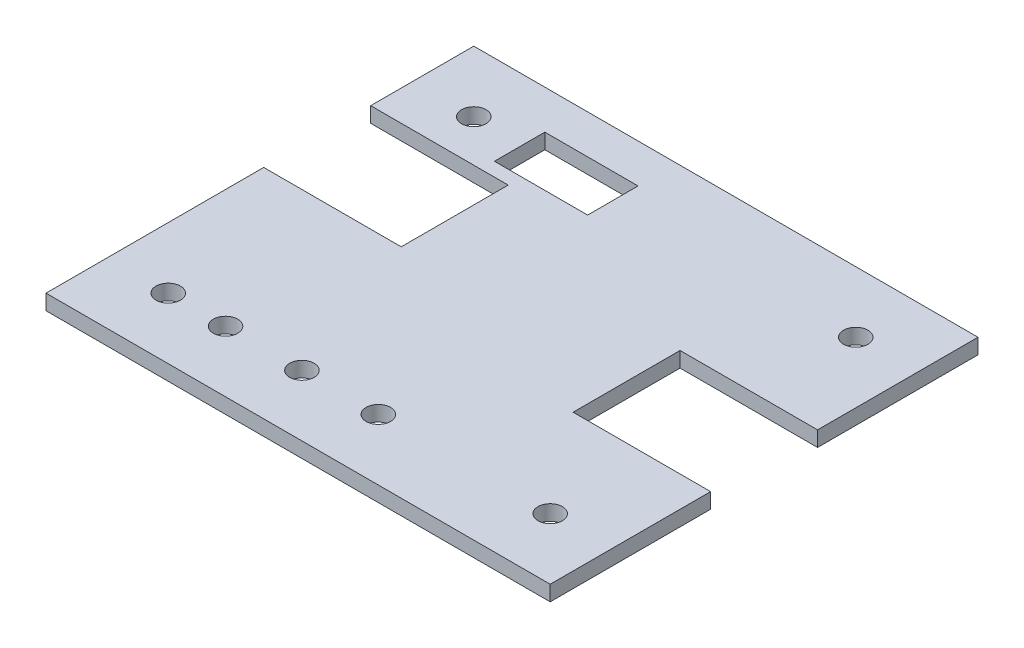
ISO-10303-21;
HEADER;
FILE_DESCRIPTION(('STEP AP214'),'2;1');
FILE_NAME('part.step','',(''),(''),'','','');
FILE_SCHEMA(('AUTOMOTIVE_DESIGN { 1 0 10303 214 1 1 1 1 }'));
ENDSEC;
DATA;
#1=APPLICATION_CONTEXT('core data for automotive mechanical design processes');
#2=APPLICATION_PROTOCOL_DEFINITION('international standard','automotive_design',2000,#1);
#3=PRODUCT_CONTEXT('',#1,'mechanical');
#4=PRODUCT('Part','Part','',(#3));
#5=PRODUCT_RELATED_PRODUCT_CATEGORY('part','',(#4));
#6=PRODUCT_DEFINITION_FORMATION('','',#4);
#7=PRODUCT_DEFINITION_CONTEXT('part definition',#1,'design');
#8=PRODUCT_DEFINITION('design','',#6,#7);
#9=PRODUCT_DEFINITION_SHAPE('','',#8);
#10=(LENGTH_UNIT() NAMED_UNIT(*) SI_UNIT(.MILLI.,.METRE.));
#11=(NAMED_UNIT(*) PLANE_ANGLE_UNIT() SI_UNIT($,.RADIAN.));
#12=(NAMED_UNIT(*) SI_UNIT($,.STERADIAN.) SOLID_ANGLE_UNIT());
#13=UNCERTAINTY_MEASURE_WITH_UNIT(LENGTH_MEASURE(1.E-05),#10,'distance_accuracy_value','');
#14=(GEOMETRIC_REPRESENTATION_CONTEXT(3) GLOBAL_UNCERTAINTY_ASSIGNED_CONTEXT((#13)) GLOBAL_UNIT_ASSIGNED_CONTEXT((#10,
#11,#12)) REPRESENTATION_CONTEXT('',''));
#15=CARTESIAN_POINT('',(0.,0.,0.));
#16=DIRECTION('',(0.,0.,1.));
#17=DIRECTION('',(1.,0.,0.));
#18=AXIS2_PLACEMENT_3D('',#15,#16,#17);
#19=CARTESIAN_POINT('',(-33.,2.,28.));
#20=DIRECTION('',(1.,0.,0.));
#21=DIRECTION('',(0.,0.,-1.));
#22=AXIS2_PLACEMENT_3D('',#19,#20,#21);
#23=PLANE('',#22);
#24=DIRECTION('',(0.,0.,1.));
#25=VECTOR('',#24,1.);
#26=CARTESIAN_POINT('',(-33.,2.,28.));
#27=LINE('',#26,#25);
#28=CARTESIAN_POINT('',(-33.,2.,-0.5));
#29=VERTEX_POINT('',#28);
#30=CARTESIAN_POINT('',(-33.,2.,28.));
#31=VERTEX_POINT('',#30);
#32=EDGE_CURVE('E270',#29,#31,#27,.T.);
#33=ORIENTED_EDGE('',*,*,#32,.F.);
#34=DIRECTION('',(0.,-1.,0.));
#35=VECTOR('',#34,1.);
#36=CARTESIAN_POINT('',(-33.,2.,-0.5));
#37=LINE('',#36,#35);
#38=CARTESIAN_POINT('',(-33.,0.,-0.5));
#39=VERTEX_POINT('',#38);
#40=EDGE_CURVE('E194',#29,#39,#37,.T.);
#41=ORIENTED_EDGE('',*,*,#40,.T.);
#42=DIRECTION('',(0.,0.,1.));
#43=VECTOR('',#42,1.);
#44=CARTESIAN_POINT('',(-33.,0.,28.));
#45=LINE('',#44,#43);
#46=CARTESIAN_POINT('',(-33.,0.,28.));
#47=VERTEX_POINT('',#46);
#48=EDGE_CURVE('E263',#39,#47,#45,.T.);
#49=ORIENTED_EDGE('',*,*,#48,.T.);
#50=DIRECTION('',(0.,-1.,0.));
#51=VECTOR('',#50,1.);
#52=CARTESIAN_POINT('',(-33.,2.,28.));
#53=LINE('',#52,#51);
#54=EDGE_CURVE('E298',#31,#47,#53,.T.);
#55=ORIENTED_EDGE('',*,*,#54,.F.);
#56=EDGE_LOOP('',(#33,#41,#49,#55));
#57=FACE_BOUND('',#56,.T.);
#58=ADVANCED_FACE('F34',(#57),#23,.F.);
#59=CARTESIAN_POINT('',(33.,2.,28.));
#60=DIRECTION('',(-1.,0.,0.));
#61=DIRECTION('',(0.,0.,1.));
#62=AXIS2_PLACEMENT_3D('',#59,#60,#61);
#63=PLANE('',#62);
#64=DIRECTION('',(0.,0.,-1.));
#65=VECTOR('',#64,1.);
#66=CARTESIAN_POINT('',(33.,0.,28.));
#67=LINE('',#66,#65);
#68=CARTESIAN_POINT('',(33.,0.,28.));
#69=VERTEX_POINT('',#68);
#70=CARTESIAN_POINT('',(33.,0.,6.99999999999999));
#71=VERTEX_POINT('',#70);
#72=EDGE_CURVE('E285',#69,#71,#67,.T.);
#73=ORIENTED_EDGE('',*,*,#72,.T.);
#74=DIRECTION('',(0.,-1.,0.));
#75=VECTOR('',#74,1.);
#76=CARTESIAN_POINT('',(33.,2.,6.99999999999999));
#77=LINE('',#76,#75);
#78=CARTESIAN_POINT('',(33.,2.,6.99999999999999));
#79=VERTEX_POINT('',#78);
#80=EDGE_CURVE('E226',#79,#71,#77,.T.);
#81=ORIENTED_EDGE('',*,*,#80,.F.);
#82=DIRECTION('',(0.,0.,-1.));
#83=VECTOR('',#82,1.);
#84=CARTESIAN_POINT('',(33.,2.,28.));
#85=LINE('',#84,#83);
#86=CARTESIAN_POINT('',(33.,2.,28.));
#87=VERTEX_POINT('',#86);
#88=EDGE_CURVE('E273',#87,#79,#85,.T.);
#89=ORIENTED_EDGE('',*,*,#88,.F.);
#90=DIRECTION('',(0.,-1.,0.));
#91=VECTOR('',#90,1.);
#92=CARTESIAN_POINT('',(33.,2.,28.));
#93=LINE('',#92,#91);
#94=EDGE_CURVE('E295',#87,#69,#93,.T.);
#95=ORIENTED_EDGE('',*,*,#94,.T.);
#96=EDGE_LOOP('',(#73,#81,#89,#95));
#97=FACE_BOUND('',#96,.T.);
#98=ADVANCED_FACE('F313',(#97),#63,.F.);
#99=CARTESIAN_POINT('',(25.,0.,20.));
#100=DIRECTION('',(0.,1.,0.));
#101=DIRECTION('',(0.,0.,1.));
#102=AXIS2_PLACEMENT_3D('',#99,#100,#101);
#103=CYLINDRICAL_SURFACE('',#102,1.6);
#104=CARTESIAN_POINT('',(25.,0.,20.));
#105=DIRECTION('',(0.,1.,0.));
#106=DIRECTION('',(0.,0.,1.));
#107=AXIS2_PLACEMENT_3D('',#104,#105,#106);
#108=CIRCLE('',#107,1.6);
#109=CARTESIAN_POINT('',(25.,0.,21.6));
#110=VERTEX_POINT('',#109);
#111=EDGE_CURVE('E42',#110,#110,#108,.T.);
#112=ORIENTED_EDGE('',*,*,#111,.F.);
#113=EDGE_LOOP('',(#112));
#114=FACE_BOUND('',#113,.T.);
#115=CARTESIAN_POINT('',(25.,2.,20.));
#116=DIRECTION('',(0.,1.,0.));
#117=DIRECTION('',(0.,0.,1.));
#118=AXIS2_PLACEMENT_3D('',#115,#116,#117);
#119=CIRCLE('',#118,1.6);
#120=CARTESIAN_POINT('',(25.,2.,21.6));
#121=VERTEX_POINT('',#120);
#122=EDGE_CURVE('E11',#121,#121,#119,.T.);
#123=ORIENTED_EDGE('',*,*,#122,.T.);
#124=EDGE_LOOP('',(#123));
#125=FACE_BOUND('',#124,.T.);
#126=ADVANCED_FACE('F36',(#114,#125),#103,.F.);
#127=CARTESIAN_POINT('',(-25.,0.,20.));
#128=DIRECTION('',(0.,1.,0.));
#129=DIRECTION('',(0.,0.,1.));
#130=AXIS2_PLACEMENT_3D('',#127,#128,#129);
#131=CYLINDRICAL_SURFACE('',#130,1.6);
#132=CARTESIAN_POINT('',(-25.,0.,20.));
#133=DIRECTION('',(0.,1.,0.));
#134=DIRECTION('',(0.,0.,1.));
#135=AXIS2_PLACEMENT_3D('',#132,#133,#134);
#136=CIRCLE('',#135,1.6);
#137=CARTESIAN_POINT('',(-25.,0.,21.6));
#138=VERTEX_POINT('',#137);
#139=EDGE_CURVE('E301',#138,#138,#136,.T.);
#140=ORIENTED_EDGE('',*,*,#139,.F.);
#141=EDGE_LOOP('',(#140));
#142=FACE_BOUND('',#141,.T.);
#143=CARTESIAN_POINT('',(-25.,2.,20.));
#144=DIRECTION('',(0.,1.,0.));
#145=DIRECTION('',(0.,0.,1.));
#146=AXIS2_PLACEMENT_3D('',#143,#144,#145);
#147=CIRCLE('',#146,1.6);
#148=CARTESIAN_POINT('',(-25.,2.,21.6));
#149=VERTEX_POINT('',#148);
#150=EDGE_CURVE('E304',#149,#149,#147,.T.);
#151=ORIENTED_EDGE('',*,*,#150,.T.);
#152=EDGE_LOOP('',(#151));
#153=FACE_BOUND('',#152,.T.);
#154=ADVANCED_FACE('F312',(#142,#153),#131,.F.);
#155=CARTESIAN_POINT('',(-33.,0.,-28.));
#156=VERTEX_POINT('',#155);
#157=CARTESIAN_POINT('',(-33.,0.,-14.5));
#158=VERTEX_POINT('',#157);
#159=EDGE_CURVE('E279',#156,#158,#45,.T.);
#160=ORIENTED_EDGE('',*,*,#159,.T.);
#161=DIRECTION('',(0.,-1.,0.));
#162=VECTOR('',#161,1.);
#163=CARTESIAN_POINT('',(-33.,2.,-14.5));
#164=LINE('',#163,#162);
#165=CARTESIAN_POINT('',(-33.,2.,-14.5));
#166=VERTEX_POINT('',#165);
#167=EDGE_CURVE('E206',#166,#158,#164,.T.);
#168=ORIENTED_EDGE('',*,*,#167,.F.);
#169=CARTESIAN_POINT('',(-33.,2.,-28.));
#170=VERTEX_POINT('',#169);
#171=EDGE_CURVE('E266',#170,#166,#27,.T.);
#172=ORIENTED_EDGE('',*,*,#171,.F.);
#173=DIRECTION('',(0.,-1.,0.));
#174=VECTOR('',#173,1.);
#175=CARTESIAN_POINT('',(-33.,2.,-28.));
#176=LINE('',#175,#174);
#177=EDGE_CURVE('E278',#170,#156,#176,.T.);
#178=ORIENTED_EDGE('',*,*,#177,.T.);
#179=EDGE_LOOP('',(#160,#168,#172,#178));
#180=FACE_BOUND('',#179,.T.);
#181=ADVANCED_FACE('F336',(#180),#23,.F.);
#182=CARTESIAN_POINT('',(33.,2.,28.));
#183=DIRECTION('',(0.,0.,-1.));
#184=DIRECTION('',(-1.,0.,0.));
#185=AXIS2_PLACEMENT_3D('',#182,#183,#184);
#186=PLANE('',#185);
#187=DIRECTION('',(1.,0.,0.));
#188=VECTOR('',#187,1.);
#189=CARTESIAN_POINT('',(33.,0.,28.));
#190=LINE('',#189,#188);
#191=EDGE_CURVE('E282',#47,#69,#190,.T.);
#192=ORIENTED_EDGE('',*,*,#191,.T.);
#193=ORIENTED_EDGE('',*,*,#94,.F.);
#194=DIRECTION('',(1.,0.,0.));
#195=VECTOR('',#194,1.);
#196=CARTESIAN_POINT('',(33.,2.,28.));
#197=LINE('',#196,#195);
#198=EDGE_CURVE('E269',#31,#87,#197,.T.);
#199=ORIENTED_EDGE('',*,*,#198,.F.);
#200=ORIENTED_EDGE('',*,*,#54,.T.);
#201=EDGE_LOOP('',(#192,#193,#199,#200));
#202=FACE_BOUND('',#201,.T.);
#203=ADVANCED_FACE('F346',(#202),#186,.F.);
#204=CARTESIAN_POINT('',(33.,2.,-7.00000000000001));
#205=VERTEX_POINT('',#204);
#206=CARTESIAN_POINT('',(33.,2.,-28.));
#207=VERTEX_POINT('',#206);
#208=EDGE_CURVE('E272',#205,#207,#85,.T.);
#209=ORIENTED_EDGE('',*,*,#208,.F.);
#210=DIRECTION('',(0.,-1.,0.));
#211=VECTOR('',#210,1.);
#212=CARTESIAN_POINT('',(33.,2.,-7.00000000000001));
#213=LINE('',#212,#211);
#214=CARTESIAN_POINT('',(33.,0.,-7.00000000000001));
#215=VERTEX_POINT('',#214);
#216=EDGE_CURVE('E229',#205,#215,#213,.T.);
#217=ORIENTED_EDGE('',*,*,#216,.T.);
#218=CARTESIAN_POINT('',(33.,0.,-28.));
#219=VERTEX_POINT('',#218);
#220=EDGE_CURVE('E284',#215,#219,#67,.T.);
#221=ORIENTED_EDGE('',*,*,#220,.T.);
#222=DIRECTION('',(0.,-1.,0.));
#223=VECTOR('',#222,1.);
#224=CARTESIAN_POINT('',(33.,2.,-28.));
#225=LINE('',#224,#223);
#226=EDGE_CURVE('E292',#207,#219,#225,.T.);
#227=ORIENTED_EDGE('',*,*,#226,.F.);
#228=EDGE_LOOP('',(#209,#217,#221,#227));
#229=FACE_BOUND('',#228,.T.);
#230=ADVANCED_FACE('F328',(#229),#63,.F.);
#231=CARTESIAN_POINT('',(33.,2.,-28.));
#232=DIRECTION('',(0.,0.,1.));
#233=DIRECTION('',(1.,0.,0.));
#234=AXIS2_PLACEMENT_3D('',#231,#232,#233);
#235=PLANE('',#234);
#236=DIRECTION('',(-1.,0.,0.));
#237=VECTOR('',#236,1.);
#238=CARTESIAN_POINT('',(33.,0.,-28.));
#239=LINE('',#238,#237);
#240=EDGE_CURVE('E288',#219,#156,#239,.T.);
#241=ORIENTED_EDGE('',*,*,#240,.T.);
#242=ORIENTED_EDGE('',*,*,#177,.F.);
#243=DIRECTION('',(-1.,0.,0.));
#244=VECTOR('',#243,1.);
#245=CARTESIAN_POINT('',(33.,2.,-28.));
#246=LINE('',#245,#244);
#247=EDGE_CURVE('E276',#207,#170,#246,.T.);
#248=ORIENTED_EDGE('',*,*,#247,.F.);
#249=ORIENTED_EDGE('',*,*,#226,.T.);
#250=EDGE_LOOP('',(#241,#242,#248,#249));
#251=FACE_BOUND('',#250,.T.);
#252=ADVANCED_FACE('F318',(#251),#235,.F.);
#253=CARTESIAN_POINT('',(0.,2.,0.));
#254=DIRECTION('',(0.,1.,0.));
#255=DIRECTION('',(0.,0.,1.));
#256=AXIS2_PLACEMENT_3D('',#253,#254,#255);
#257=PLANE('',#256);
#258=DIRECTION('',(-1.,0.,0.));
#259=VECTOR('',#258,1.);
#260=CARTESIAN_POINT('',(-18.599974599949,2.,-22.899995024811));
#261=LINE('',#260,#259);
#262=CARTESIAN_POINT('',(-6.39997459994901,2.,-22.899995024811));
#263=VERTEX_POINT('',#262);
#264=CARTESIAN_POINT('',(-18.599974599949,2.,-22.899995024811));
#265=VERTEX_POINT('',#264);
#266=EDGE_CURVE('E49',#263,#265,#261,.T.);
#267=ORIENTED_EDGE('',*,*,#266,.F.);
#268=DIRECTION('',(0.,0.,-1.));
#269=VECTOR('',#268,1.);
#270=CARTESIAN_POINT('',(-6.39997459994901,2.,-22.899995024811));
#271=LINE('',#270,#269);
#272=CARTESIAN_POINT('',(-6.39997459994901,2.,-16.299995024811));
#273=VERTEX_POINT('',#272);
#274=EDGE_CURVE('E165',#273,#263,#271,.T.);
#275=ORIENTED_EDGE('',*,*,#274,.F.);
#276=DIRECTION('',(1.,0.,0.));
#277=VECTOR('',#276,1.);
#278=CARTESIAN_POINT('',(-18.599974599949,2.,-16.299995024811));
#279=LINE('',#278,#277);
#280=CARTESIAN_POINT('',(-18.599974599949,2.,-16.299995024811));
#281=VERTEX_POINT('',#280);
#282=EDGE_CURVE('E168',#281,#273,#279,.T.);
#283=ORIENTED_EDGE('',*,*,#282,.F.);
#284=DIRECTION('',(0.,0.,1.));
#285=VECTOR('',#284,1.);
#286=CARTESIAN_POINT('',(-18.599974599949,2.,-22.899995024811));
#287=LINE('',#286,#285);
#288=EDGE_CURVE('E174',#265,#281,#287,.T.);
#289=ORIENTED_EDGE('',*,*,#288,.F.);
#290=EDGE_LOOP('',(#267,#275,#283,#289));
#291=FACE_BOUND('',#290,.T.);
#292=DIRECTION('',(-1.,0.,0.));
#293=VECTOR('',#292,1.);
#294=CARTESIAN_POINT('',(-33.,2.,-0.5));
#295=LINE('',#294,#293);
#296=CARTESIAN_POINT('',(-15.,2.,-0.499999999999995));
#297=VERTEX_POINT('',#296);
#298=EDGE_CURVE('E184',#297,#29,#295,.T.);
#299=ORIENTED_EDGE('',*,*,#298,.T.);
#300=ORIENTED_EDGE('',*,*,#32,.T.);
#301=ORIENTED_EDGE('',*,*,#198,.T.);
#302=ORIENTED_EDGE('',*,*,#88,.T.);
#303=DIRECTION('',(-1.,0.,0.));
#304=VECTOR('',#303,1.);
#305=CARTESIAN_POINT('',(33.,2.,6.99999999999999));
#306=LINE('',#305,#304);
#307=CARTESIAN_POINT('',(15.,2.,6.99999999999999));
#308=VERTEX_POINT('',#307);
#309=EDGE_CURVE('E210',#79,#308,#306,.T.);
#310=ORIENTED_EDGE('',*,*,#309,.T.);
#311=DIRECTION('',(0.,0.,-1.));
#312=VECTOR('',#311,1.);
#313=CARTESIAN_POINT('',(15.,2.,6.99999999999999));
#314=LINE('',#313,#312);
#315=CARTESIAN_POINT('',(15.,2.,-7.00000000000001));
#316=VERTEX_POINT('',#315);
#317=EDGE_CURVE('E213',#308,#316,#314,.T.);
#318=ORIENTED_EDGE('',*,*,#317,.T.);
#319=DIRECTION('',(1.,0.,0.));
#320=VECTOR('',#319,1.);
#321=CARTESIAN_POINT('',(33.,2.,-7.00000000000001));
#322=LINE('',#321,#320);
#323=EDGE_CURVE('E217',#316,#205,#322,.T.);
#324=ORIENTED_EDGE('',*,*,#323,.T.);
#325=ORIENTED_EDGE('',*,*,#208,.T.);
#326=ORIENTED_EDGE('',*,*,#247,.T.);
#327=ORIENTED_EDGE('',*,*,#171,.T.);
#328=DIRECTION('',(1.,0.,0.));
#329=VECTOR('',#328,1.);
#330=CARTESIAN_POINT('',(-33.,2.,-14.5));
#331=LINE('',#330,#329);
#332=CARTESIAN_POINT('',(-15.,2.,-14.5));
#333=VERTEX_POINT('',#332);
#334=EDGE_CURVE('E187',#166,#333,#331,.T.);
#335=ORIENTED_EDGE('',*,*,#334,.T.);
#336=DIRECTION('',(0.,0.,1.));
#337=VECTOR('',#336,1.);
#338=CARTESIAN_POINT('',(-15.,2.,-0.499999999999995));
#339=LINE('',#338,#337);
#340=EDGE_CURVE('E191',#333,#297,#339,.T.);
#341=ORIENTED_EDGE('',*,*,#340,.T.);
#342=EDGE_LOOP('',(#299,#300,#301,#302,#310,#318,#324,#325,#326,#327,#335,#341));
#343=FACE_BOUND('',#342,.T.);
#344=CARTESIAN_POINT('',(-17.499984759969,2.,20.000078740158));
#345=DIRECTION('',(0.,-1.,0.));
#346=DIRECTION('',(0.,0.,-1.));
#347=AXIS2_PLACEMENT_3D('',#344,#345,#346);
#348=CIRCLE('',#347,1.6);
#349=CARTESIAN_POINT('',(-17.499984759969,2.,18.400078740158));
#350=VERTEX_POINT('',#349);
#351=EDGE_CURVE('E236',#350,#350,#348,.T.);
#352=ORIENTED_EDGE('',*,*,#351,.T.);
#353=EDGE_LOOP('',(#352));
#354=FACE_BOUND('',#353,.T.);
#355=CARTESIAN_POINT('',(-7.499964439929,2.,20.000078740158));
#356=DIRECTION('',(0.,-1.,0.));
#357=DIRECTION('',(0.,0.,-1.));
#358=AXIS2_PLACEMENT_3D('',#355,#356,#357);
#359=CIRCLE('',#358,1.6);
#360=CARTESIAN_POINT('',(-7.499964439929,2.,18.400078740158));
#361=VERTEX_POINT('',#360);
#362=EDGE_CURVE('E243',#361,#361,#359,.T.);
#363=ORIENTED_EDGE('',*,*,#362,.T.);
#364=EDGE_LOOP('',(#363));
#365=FACE_BOUND('',#364,.T.);
#366=CARTESIAN_POINT('',(2.499855219711,2.,19.999735839472));
#367=DIRECTION('',(0.,-1.,0.));
#368=DIRECTION('',(0.,0.,-1.));
#369=AXIS2_PLACEMENT_3D('',#366,#367,#368);
#370=CIRCLE('',#369,1.6);
#371=CARTESIAN_POINT('',(2.499855219711,2.,18.399735839472));
#372=VERTEX_POINT('',#371);
#373=EDGE_CURVE('E249',#372,#372,#370,.T.);
#374=ORIENTED_EDGE('',*,*,#373,.T.);
#375=EDGE_LOOP('',(#374));
#376=FACE_BOUND('',#375,.T.);
#377=CARTESIAN_POINT('',(25.,2.,-20.));
#378=DIRECTION('',(0.,1.,0.));
#379=DIRECTION('',(0.,0.,1.));
#380=AXIS2_PLACEMENT_3D('',#377,#378,#379);
#381=CIRCLE('',#380,1.6);
#382=CARTESIAN_POINT('',(25.,2.,-18.4));
#383=VERTEX_POINT('',#382);
#384=EDGE_CURVE('E256',#383,#383,#381,.T.);
#385=ORIENTED_EDGE('',*,*,#384,.F.);
#386=EDGE_LOOP('',(#385));
#387=FACE_BOUND('',#386,.T.);
#388=CARTESIAN_POINT('',(-25.,2.,-20.));
#389=DIRECTION('',(0.,1.,0.));
#390=DIRECTION('',(0.,0.,1.));
#391=AXIS2_PLACEMENT_3D('',#388,#389,#390);
#392=CIRCLE('',#391,1.6);
#393=CARTESIAN_POINT('',(-25.,2.,-18.4));
#394=VERTEX_POINT('',#393);
#395=EDGE_CURVE('E259',#394,#394,#392,.T.);
#396=ORIENTED_EDGE('',*,*,#395,.F.);
#397=EDGE_LOOP('',(#396));
#398=FACE_BOUND('',#397,.T.);
#399=ORIENTED_EDGE('',*,*,#150,.F.);
#400=EDGE_LOOP('',(#399));
#401=FACE_BOUND('',#400,.T.);
#402=ORIENTED_EDGE('',*,*,#122,.F.);
#403=EDGE_LOOP('',(#402));
#404=FACE_BOUND('',#403,.T.);
#405=ADVANCED_FACE('F316',(#291,#343,#354,#365,#376,#387,#398,#401,#404),#257,.T.);
#406=CARTESIAN_POINT('',(0.,0.,0.));
#407=DIRECTION('',(0.,1.,0.));
#408=DIRECTION('',(0.,0.,1.));
#409=AXIS2_PLACEMENT_3D('',#406,#407,#408);
#410=PLANE('',#409);
#411=DIRECTION('',(0.,0.,-1.));
#412=VECTOR('',#411,1.);
#413=CARTESIAN_POINT('',(-6.39997459994901,0.,-22.899995024811));
#414=LINE('',#413,#412);
#415=CARTESIAN_POINT('',(-6.39997459994901,0.,-16.299995024811));
#416=VERTEX_POINT('',#415);
#417=CARTESIAN_POINT('',(-6.39997459994901,0.,-22.899995024811));
#418=VERTEX_POINT('',#417);
#419=EDGE_CURVE('E155',#416,#418,#414,.T.);
#420=ORIENTED_EDGE('',*,*,#419,.T.);
#421=DIRECTION('',(-1.,0.,0.));
#422=VECTOR('',#421,1.);
#423=CARTESIAN_POINT('',(-18.599974599949,0.,-22.899995024811));
#424=LINE('',#423,#422);
#425=CARTESIAN_POINT('',(-18.599974599949,0.,-22.899995024811));
#426=VERTEX_POINT('',#425);
#427=EDGE_CURVE('E149',#418,#426,#424,.T.);
#428=ORIENTED_EDGE('',*,*,#427,.T.);
#429=DIRECTION('',(0.,0.,1.));
#430=VECTOR('',#429,1.);
#431=CARTESIAN_POINT('',(-18.599974599949,0.,-22.899995024811));
#432=LINE('',#431,#430);
#433=CARTESIAN_POINT('',(-18.599974599949,0.,-16.299995024811));
#434=VERTEX_POINT('',#433);
#435=EDGE_CURVE('E158',#426,#434,#432,.T.);
#436=ORIENTED_EDGE('',*,*,#435,.T.);
#437=DIRECTION('',(1.,0.,0.));
#438=VECTOR('',#437,1.);
#439=CARTESIAN_POINT('',(-18.599974599949,0.,-16.299995024811));
#440=LINE('',#439,#438);
#441=EDGE_CURVE('E57',#434,#416,#440,.T.);
#442=ORIENTED_EDGE('',*,*,#441,.T.);
#443=EDGE_LOOP('',(#420,#428,#436,#442));
#444=FACE_BOUND('',#443,.T.);
#445=CARTESIAN_POINT('',(-17.499984759969,0.,20.000078740158));
#446=DIRECTION('',(0.,-1.,0.));
#447=DIRECTION('',(0.,0.,-1.));
#448=AXIS2_PLACEMENT_3D('',#445,#446,#447);
#449=CIRCLE('',#448,1.6);
#450=CARTESIAN_POINT('',(-17.499984759969,0.,18.400078740158));
#451=VERTEX_POINT('',#450);
#452=EDGE_CURVE('E240',#451,#451,#449,.T.);
#453=ORIENTED_EDGE('',*,*,#452,.F.);
#454=EDGE_LOOP('',(#453));
#455=FACE_BOUND('',#454,.T.);
#456=CARTESIAN_POINT('',(-7.499964439929,0.,20.000078740158));
#457=DIRECTION('',(0.,-1.,0.));
#458=DIRECTION('',(0.,0.,-1.));
#459=AXIS2_PLACEMENT_3D('',#456,#457,#458);
#460=CIRCLE('',#459,1.6);
#461=CARTESIAN_POINT('',(-7.499964439929,0.,18.400078740158));
#462=VERTEX_POINT('',#461);
#463=EDGE_CURVE('E246',#462,#462,#460,.T.);
#464=ORIENTED_EDGE('',*,*,#463,.F.);
#465=EDGE_LOOP('',(#464));
#466=FACE_BOUND('',#465,.T.);
#467=CARTESIAN_POINT('',(2.499855219711,0.,19.999735839472));
#468=DIRECTION('',(0.,-1.,0.));
#469=DIRECTION('',(0.,0.,-1.));
#470=AXIS2_PLACEMENT_3D('',#467,#468,#469);
#471=CIRCLE('',#470,1.6);
#472=CARTESIAN_POINT('',(2.499855219711,0.,18.399735839472));
#473=VERTEX_POINT('',#472);
#474=EDGE_CURVE('E228',#473,#473,#471,.T.);
#475=ORIENTED_EDGE('',*,*,#474,.F.);
#476=EDGE_LOOP('',(#475));
#477=FACE_BOUND('',#476,.T.);
#478=CARTESIAN_POINT('',(25.,0.,-20.));
#479=DIRECTION('',(0.,1.,0.));
#480=DIRECTION('',(0.,0.,1.));
#481=AXIS2_PLACEMENT_3D('',#478,#479,#480);
#482=CIRCLE('',#481,1.6);
#483=CARTESIAN_POINT('',(25.,0.,-18.4));
#484=VERTEX_POINT('',#483);
#485=EDGE_CURVE('E239',#484,#484,#482,.T.);
#486=ORIENTED_EDGE('',*,*,#485,.T.);
#487=EDGE_LOOP('',(#486));
#488=FACE_BOUND('',#487,.T.);
#489=CARTESIAN_POINT('',(-25.,0.,-20.));
#490=DIRECTION('',(0.,1.,0.));
#491=DIRECTION('',(0.,0.,1.));
#492=AXIS2_PLACEMENT_3D('',#489,#490,#491);
#493=CIRCLE('',#492,1.6);
#494=CARTESIAN_POINT('',(-25.,0.,-18.4));
#495=VERTEX_POINT('',#494);
#496=EDGE_CURVE('E260',#495,#495,#493,.T.);
#497=ORIENTED_EDGE('',*,*,#496,.T.);
#498=EDGE_LOOP('',(#497));
#499=FACE_BOUND('',#498,.T.);
#500=ORIENTED_EDGE('',*,*,#48,.F.);
#501=DIRECTION('',(-1.,0.,0.));
#502=VECTOR('',#501,1.);
#503=CARTESIAN_POINT('',(-33.,0.,-0.5));
#504=LINE('',#503,#502);
#505=CARTESIAN_POINT('',(-15.,0.,-0.499999999999995));
#506=VERTEX_POINT('',#505);
#507=EDGE_CURVE('E180',#506,#39,#504,.T.);
#508=ORIENTED_EDGE('',*,*,#507,.F.);
#509=DIRECTION('',(0.,0.,1.));
#510=VECTOR('',#509,1.);
#511=CARTESIAN_POINT('',(-15.,0.,-0.499999999999995));
#512=LINE('',#511,#510);
#513=CARTESIAN_POINT('',(-15.,0.,-14.5));
#514=VERTEX_POINT('',#513);
#515=EDGE_CURVE('E188',#514,#506,#512,.T.);
#516=ORIENTED_EDGE('',*,*,#515,.F.);
#517=DIRECTION('',(1.,0.,0.));
#518=VECTOR('',#517,1.);
#519=CARTESIAN_POINT('',(-33.,0.,-14.5));
#520=LINE('',#519,#518);
#521=EDGE_CURVE('E196',#158,#514,#520,.T.);
#522=ORIENTED_EDGE('',*,*,#521,.F.);
#523=ORIENTED_EDGE('',*,*,#159,.F.);
#524=ORIENTED_EDGE('',*,*,#240,.F.);
#525=ORIENTED_EDGE('',*,*,#220,.F.);
#526=DIRECTION('',(1.,0.,0.));
#527=VECTOR('',#526,1.);
#528=CARTESIAN_POINT('',(33.,0.,-7.00000000000001));
#529=LINE('',#528,#527);
#530=CARTESIAN_POINT('',(15.,0.,-7.00000000000001));
#531=VERTEX_POINT('',#530);
#532=EDGE_CURVE('E214',#531,#215,#529,.T.);
#533=ORIENTED_EDGE('',*,*,#532,.F.);
#534=DIRECTION('',(0.,0.,-1.));
#535=VECTOR('',#534,1.);
#536=CARTESIAN_POINT('',(15.,0.,6.99999999999999));
#537=LINE('',#536,#535);
#538=CARTESIAN_POINT('',(15.,0.,6.99999999999999));
#539=VERTEX_POINT('',#538);
#540=EDGE_CURVE('E222',#539,#531,#537,.T.);
#541=ORIENTED_EDGE('',*,*,#540,.F.);
#542=DIRECTION('',(-1.,0.,0.));
#543=VECTOR('',#542,1.);
#544=CARTESIAN_POINT('',(33.,0.,6.99999999999999));
#545=LINE('',#544,#543);
#546=EDGE_CURVE('E203',#71,#539,#545,.T.);
#547=ORIENTED_EDGE('',*,*,#546,.F.);
#548=ORIENTED_EDGE('',*,*,#72,.F.);
#549=ORIENTED_EDGE('',*,*,#191,.F.);
#550=EDGE_LOOP('',(#500,#508,#516,#522,#523,#524,#525,#533,#541,#547,#548,#549));
#551=FACE_BOUND('',#550,.T.);
#552=ORIENTED_EDGE('',*,*,#139,.T.);
#553=EDGE_LOOP('',(#552));
#554=FACE_BOUND('',#553,.T.);
#555=ORIENTED_EDGE('',*,*,#111,.T.);
#556=EDGE_LOOP('',(#555));
#557=FACE_BOUND('',#556,.T.);
#558=ADVANCED_FACE('F162',(#444,#455,#466,#477,#488,#499,#551,#554,#557),#410,.F.);
#559=CARTESIAN_POINT('',(-25.,0.,-20.));
#560=DIRECTION('',(0.,1.,0.));
#561=DIRECTION('',(0.,0.,1.));
#562=AXIS2_PLACEMENT_3D('',#559,#560,#561);
#563=CYLINDRICAL_SURFACE('',#562,1.6);
#564=ORIENTED_EDGE('',*,*,#496,.F.);
#565=EDGE_LOOP('',(#564));
#566=FACE_BOUND('',#565,.T.);
#567=ORIENTED_EDGE('',*,*,#395,.T.);
#568=EDGE_LOOP('',(#567));
#569=FACE_BOUND('',#568,.T.);
#570=ADVANCED_FACE('F325',(#566,#569),#563,.F.);
#571=CARTESIAN_POINT('',(25.,0.,-20.));
#572=DIRECTION('',(0.,1.,0.));
#573=DIRECTION('',(0.,0.,1.));
#574=AXIS2_PLACEMENT_3D('',#571,#572,#573);
#575=CYLINDRICAL_SURFACE('',#574,1.6);
#576=ORIENTED_EDGE('',*,*,#485,.F.);
#577=EDGE_LOOP('',(#576));
#578=FACE_BOUND('',#577,.T.);
#579=ORIENTED_EDGE('',*,*,#384,.T.);
#580=EDGE_LOOP('',(#579));
#581=FACE_BOUND('',#580,.T.);
#582=ADVANCED_FACE('F426',(#578,#581),#575,.F.);
#583=CARTESIAN_POINT('',(2.499855219711,2.,19.999735839472));
#584=DIRECTION('',(0.,-1.,0.));
#585=DIRECTION('',(0.,0.,-1.));
#586=AXIS2_PLACEMENT_3D('',#583,#584,#585);
#587=CYLINDRICAL_SURFACE('',#586,1.6);
#588=ORIENTED_EDGE('',*,*,#373,.F.);
#589=EDGE_LOOP('',(#588));
#590=FACE_BOUND('',#589,.T.);
#591=ORIENTED_EDGE('',*,*,#474,.T.);
#592=EDGE_LOOP('',(#591));
#593=FACE_BOUND('',#592,.T.);
#594=ADVANCED_FACE('F422',(#590,#593),#587,.F.);
#595=CARTESIAN_POINT('',(-7.499964439929,2.,20.000078740158));
#596=DIRECTION('',(0.,-1.,0.));
#597=DIRECTION('',(0.,0.,-1.));
#598=AXIS2_PLACEMENT_3D('',#595,#596,#597);
#599=CYLINDRICAL_SURFACE('',#598,1.6);
#600=ORIENTED_EDGE('',*,*,#362,.F.);
#601=EDGE_LOOP('',(#600));
#602=FACE_BOUND('',#601,.T.);
#603=ORIENTED_EDGE('',*,*,#463,.T.);
#604=EDGE_LOOP('',(#603));
#605=FACE_BOUND('',#604,.T.);
#606=ADVANCED_FACE('F418',(#602,#605),#599,.F.);
#607=CARTESIAN_POINT('',(-17.499984759969,2.,20.000078740158));
#608=DIRECTION('',(0.,-1.,0.));
#609=DIRECTION('',(0.,0.,-1.));
#610=AXIS2_PLACEMENT_3D('',#607,#608,#609);
#611=CYLINDRICAL_SURFACE('',#610,1.6);
#612=ORIENTED_EDGE('',*,*,#351,.F.);
#613=EDGE_LOOP('',(#612));
#614=FACE_BOUND('',#613,.T.);
#615=ORIENTED_EDGE('',*,*,#452,.T.);
#616=EDGE_LOOP('',(#615));
#617=FACE_BOUND('',#616,.T.);
#618=ADVANCED_FACE('F415',(#614,#617),#611,.F.);
#619=CARTESIAN_POINT('',(33.,2.,6.99999999999999));
#620=DIRECTION('',(0.,0.,1.));
#621=DIRECTION('',(1.,0.,0.));
#622=AXIS2_PLACEMENT_3D('',#619,#620,#621);
#623=PLANE('',#622);
#624=ORIENTED_EDGE('',*,*,#546,.T.);
#625=DIRECTION('',(0.,-1.,0.));
#626=VECTOR('',#625,1.);
#627=CARTESIAN_POINT('',(15.,2.,6.99999999999999));
#628=LINE('',#627,#626);
#629=EDGE_CURVE('E220',#308,#539,#628,.T.);
#630=ORIENTED_EDGE('',*,*,#629,.F.);
#631=ORIENTED_EDGE('',*,*,#309,.F.);
#632=ORIENTED_EDGE('',*,*,#80,.T.);
#633=EDGE_LOOP('',(#624,#630,#631,#632));
#634=FACE_BOUND('',#633,.T.);
#635=ADVANCED_FACE('F385',(#634),#623,.F.);
#636=CARTESIAN_POINT('',(33.,2.,-7.00000000000001));
#637=DIRECTION('',(0.,0.,-1.));
#638=DIRECTION('',(-1.,0.,0.));
#639=AXIS2_PLACEMENT_3D('',#636,#637,#638);
#640=PLANE('',#639);
#641=ORIENTED_EDGE('',*,*,#532,.T.);
#642=ORIENTED_EDGE('',*,*,#216,.F.);
#643=ORIENTED_EDGE('',*,*,#323,.F.);
#644=DIRECTION('',(0.,-1.,0.));
#645=VECTOR('',#644,1.);
#646=CARTESIAN_POINT('',(15.,2.,-7.00000000000001));
#647=LINE('',#646,#645);
#648=EDGE_CURVE('E232',#316,#531,#647,.T.);
#649=ORIENTED_EDGE('',*,*,#648,.T.);
#650=EDGE_LOOP('',(#641,#642,#643,#649));
#651=FACE_BOUND('',#650,.T.);
#652=ADVANCED_FACE('F379',(#651),#640,.F.);
#653=CARTESIAN_POINT('',(15.,2.,6.99999999999999));
#654=DIRECTION('',(-1.,0.,0.));
#655=DIRECTION('',(0.,0.,1.));
#656=AXIS2_PLACEMENT_3D('',#653,#654,#655);
#657=PLANE('',#656);
#658=ORIENTED_EDGE('',*,*,#540,.T.);
#659=ORIENTED_EDGE('',*,*,#648,.F.);
#660=ORIENTED_EDGE('',*,*,#317,.F.);
#661=ORIENTED_EDGE('',*,*,#629,.T.);
#662=EDGE_LOOP('',(#658,#659,#660,#661));
#663=FACE_BOUND('',#662,.T.);
#664=ADVANCED_FACE('F383',(#663),#657,.F.);
#665=CARTESIAN_POINT('',(-33.,2.,-0.5));
#666=DIRECTION('',(0.,0.,1.));
#667=DIRECTION('',(1.,0.,0.));
#668=AXIS2_PLACEMENT_3D('',#665,#666,#667);
#669=PLANE('',#668);
#670=ORIENTED_EDGE('',*,*,#507,.T.);
#671=ORIENTED_EDGE('',*,*,#40,.F.);
#672=ORIENTED_EDGE('',*,*,#298,.F.);
#673=DIRECTION('',(0.,-1.,0.));
#674=VECTOR('',#673,1.);
#675=CARTESIAN_POINT('',(-15.,2.,-0.499999999999995));
#676=LINE('',#675,#674);
#677=EDGE_CURVE('E201',#297,#506,#676,.T.);
#678=ORIENTED_EDGE('',*,*,#677,.T.);
#679=EDGE_LOOP('',(#670,#671,#672,#678));
#680=FACE_BOUND('',#679,.T.);
#681=ADVANCED_FACE('F395',(#680),#669,.F.);
#682=CARTESIAN_POINT('',(-15.,2.,-0.499999999999995));
#683=DIRECTION('',(1.,0.,0.));
#684=DIRECTION('',(0.,0.,-1.));
#685=AXIS2_PLACEMENT_3D('',#682,#683,#684);
#686=PLANE('',#685);
#687=ORIENTED_EDGE('',*,*,#515,.T.);
#688=ORIENTED_EDGE('',*,*,#677,.F.);
#689=ORIENTED_EDGE('',*,*,#340,.F.);
#690=DIRECTION('',(0.,-1.,0.));
#691=VECTOR('',#690,1.);
#692=CARTESIAN_POINT('',(-15.,2.,-14.5));
#693=LINE('',#692,#691);
#694=EDGE_CURVE('E204',#333,#514,#693,.T.);
#695=ORIENTED_EDGE('',*,*,#694,.T.);
#696=EDGE_LOOP('',(#687,#688,#689,#695));
#697=FACE_BOUND('',#696,.T.);
#698=ADVANCED_FACE('F397',(#697),#686,.F.);
#699=CARTESIAN_POINT('',(-33.,2.,-14.5));
#700=DIRECTION('',(0.,0.,-1.));
#701=DIRECTION('',(-1.,0.,0.));
#702=AXIS2_PLACEMENT_3D('',#699,#700,#701);
#703=PLANE('',#702);
#704=ORIENTED_EDGE('',*,*,#521,.T.);
#705=ORIENTED_EDGE('',*,*,#694,.F.);
#706=ORIENTED_EDGE('',*,*,#334,.F.);
#707=ORIENTED_EDGE('',*,*,#167,.T.);
#708=EDGE_LOOP('',(#704,#705,#706,#707));
#709=FACE_BOUND('',#708,.T.);
#710=ADVANCED_FACE('F368',(#709),#703,.F.);
#711=CARTESIAN_POINT('',(-18.599974599949,0.,-22.899995024811));
#712=DIRECTION('',(0.,0.,-1.));
#713=DIRECTION('',(-1.,0.,0.));
#714=AXIS2_PLACEMENT_3D('',#711,#712,#713);
#715=PLANE('',#714);
#716=ORIENTED_EDGE('',*,*,#266,.T.);
#717=DIRECTION('',(0.,1.,0.));
#718=VECTOR('',#717,1.);
#719=CARTESIAN_POINT('',(-18.599974599949,0.,-22.899995024811));
#720=LINE('',#719,#718);
#721=EDGE_CURVE('E145',#426,#265,#720,.T.);
#722=ORIENTED_EDGE('',*,*,#721,.F.);
#723=ORIENTED_EDGE('',*,*,#427,.F.);
#724=DIRECTION('',(0.,1.,0.));
#725=VECTOR('',#724,1.);
#726=CARTESIAN_POINT('',(-6.39997459994901,0.,-22.899995024811));
#727=LINE('',#726,#725);
#728=EDGE_CURVE('E178',#418,#263,#727,.T.);
#729=ORIENTED_EDGE('',*,*,#728,.T.);
#730=EDGE_LOOP('',(#716,#722,#723,#729));
#731=FACE_BOUND('',#730,.T.);
#732=ADVANCED_FACE('F147',(#731),#715,.F.);
#733=CARTESIAN_POINT('',(-6.39997459994901,0.,-22.899995024811));
#734=DIRECTION('',(1.,0.,0.));
#735=DIRECTION('',(0.,0.,-1.));
#736=AXIS2_PLACEMENT_3D('',#733,#734,#735);
#737=PLANE('',#736);
#738=ORIENTED_EDGE('',*,*,#274,.T.);
#739=ORIENTED_EDGE('',*,*,#728,.F.);
#740=ORIENTED_EDGE('',*,*,#419,.F.);
#741=DIRECTION('',(0.,1.,0.));
#742=VECTOR('',#741,1.);
#743=CARTESIAN_POINT('',(-6.39997459994901,0.,-16.299995024811));
#744=LINE('',#743,#742);
#745=EDGE_CURVE('E181',#416,#273,#744,.T.);
#746=ORIENTED_EDGE('',*,*,#745,.T.);
#747=EDGE_LOOP('',(#738,#739,#740,#746));
#748=FACE_BOUND('',#747,.T.);
#749=ADVANCED_FACE('F506',(#748),#737,.F.);
#750=CARTESIAN_POINT('',(-18.599974599949,0.,-16.299995024811));
#751=DIRECTION('',(0.,0.,1.));
#752=DIRECTION('',(1.,0.,0.));
#753=AXIS2_PLACEMENT_3D('',#750,#751,#752);
#754=PLANE('',#753);
#755=ORIENTED_EDGE('',*,*,#282,.T.);
#756=ORIENTED_EDGE('',*,*,#745,.F.);
#757=ORIENTED_EDGE('',*,*,#441,.F.);
#758=DIRECTION('',(0.,1.,0.));
#759=VECTOR('',#758,1.);
#760=CARTESIAN_POINT('',(-18.599974599949,0.,-16.299995024811));
#761=LINE('',#760,#759);
#762=EDGE_CURVE('E154',#434,#281,#761,.T.);
#763=ORIENTED_EDGE('',*,*,#762,.T.);
#764=EDGE_LOOP('',(#755,#756,#757,#763));
#765=FACE_BOUND('',#764,.T.);
#766=ADVANCED_FACE('F511',(#765),#754,.F.);
#767=CARTESIAN_POINT('',(-18.599974599949,0.,-22.899995024811));
#768=DIRECTION('',(-1.,0.,0.));
#769=DIRECTION('',(0.,0.,1.));
#770=AXIS2_PLACEMENT_3D('',#767,#768,#769);
#771=PLANE('',#770);
#772=ORIENTED_EDGE('',*,*,#288,.T.);
#773=ORIENTED_EDGE('',*,*,#762,.F.);
#774=ORIENTED_EDGE('',*,*,#435,.F.);
#775=ORIENTED_EDGE('',*,*,#721,.T.);
#776=EDGE_LOOP('',(#772,#773,#774,#775));
#777=FACE_BOUND('',#776,.T.);
#778=ADVANCED_FACE('F159',(#777),#771,.F.);
#779=CLOSED_SHELL('',(#58,#98,#126,#154,#181,#203,#230,#252,#405,#558,#570,#582,#594,#606,#618,
#635,#652,#664,#681,#698,#710,#732,#749,#766,#778));
#780=MANIFOLD_SOLID_BREP('B2',#779);
#781=ADVANCED_BREP_SHAPE_REPRESENTATION('',(#18,#780),#14);
#782=SHAPE_DEFINITION_REPRESENTATION(#9,#781);
ENDSEC;
END-ISO-10303-21;
